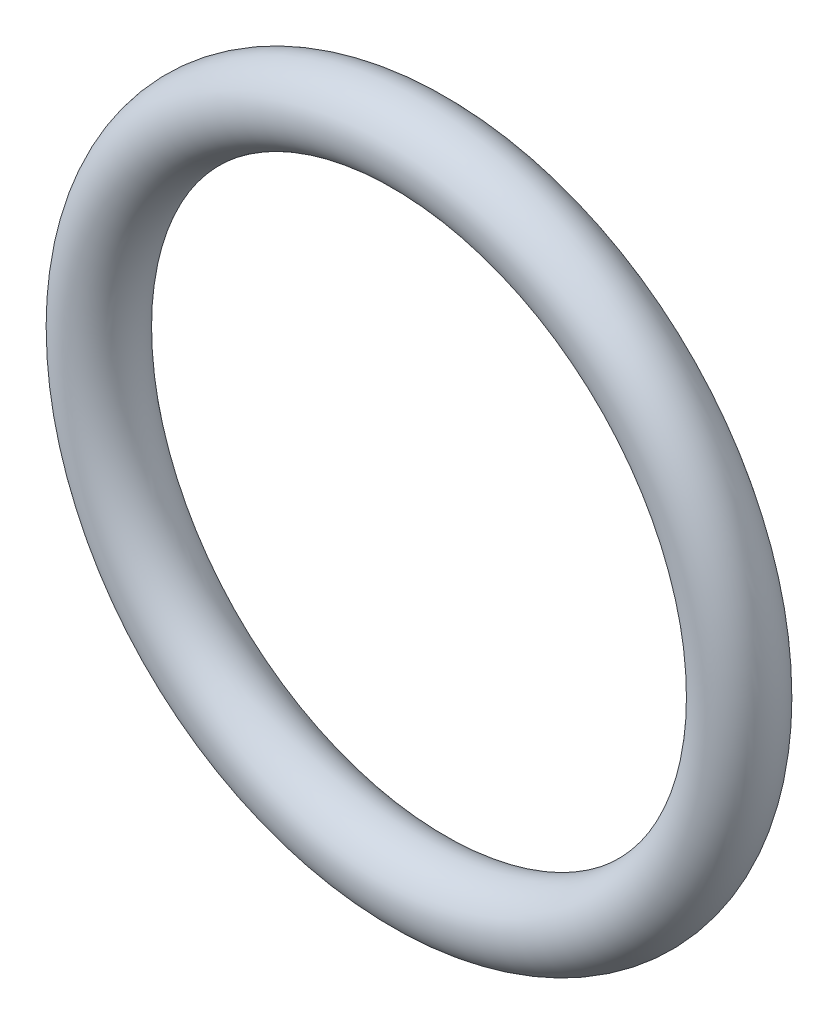
ISO-10303-21;
HEADER;
FILE_DESCRIPTION(('STEP AP214'),'2;1');
FILE_NAME('part.step','',(''),(''),'','','');
FILE_SCHEMA(('AUTOMOTIVE_DESIGN { 1 0 10303 214 1 1 1 1 }'));
ENDSEC;
DATA;
#1=APPLICATION_CONTEXT('core data for automotive mechanical design processes');
#2=APPLICATION_PROTOCOL_DEFINITION('international standard','automotive_design',2000,#1);
#3=PRODUCT_CONTEXT('',#1,'mechanical');
#4=PRODUCT('Part','Part','',(#3));
#5=PRODUCT_RELATED_PRODUCT_CATEGORY('part','',(#4));
#6=PRODUCT_DEFINITION_FORMATION('','',#4);
#7=PRODUCT_DEFINITION_CONTEXT('part definition',#1,'design');
#8=PRODUCT_DEFINITION('design','',#6,#7);
#9=PRODUCT_DEFINITION_SHAPE('','',#8);
#10=(LENGTH_UNIT() NAMED_UNIT(*) SI_UNIT(.MILLI.,.METRE.));
#11=(NAMED_UNIT(*) PLANE_ANGLE_UNIT() SI_UNIT($,.RADIAN.));
#12=(NAMED_UNIT(*) SI_UNIT($,.STERADIAN.) SOLID_ANGLE_UNIT());
#13=UNCERTAINTY_MEASURE_WITH_UNIT(LENGTH_MEASURE(1.E-05),#10,'distance_accuracy_value','');
#14=(GEOMETRIC_REPRESENTATION_CONTEXT(3) GLOBAL_UNCERTAINTY_ASSIGNED_CONTEXT((#13)) GLOBAL_UNIT_ASSIGNED_CONTEXT((#10,
#11,#12)) REPRESENTATION_CONTEXT('',''));
#15=CARTESIAN_POINT('',(0.,0.,0.));
#16=DIRECTION('',(0.,0.,1.));
#17=DIRECTION('',(1.,0.,0.));
#18=AXIS2_PLACEMENT_3D('',#15,#16,#17);
#19=CARTESIAN_POINT('',(0.,0.,-10.025));
#20=DIRECTION('',(0.,0.,-1.));
#21=DIRECTION('',(-1.,0.,0.));
#22=AXIS2_PLACEMENT_3D('',#19,#20,#21);
#23=TOROIDAL_SURFACE('',#22,9.484995,1.105);
#24=CARTESIAN_POINT('',(-10.589995,0.,-10.025));
#25=VERTEX_POINT('',#24);
#26=VERTEX_LOOP('',#25);
#27=FACE_BOUND('',#26,.T.);
#28=ADVANCED_FACE('F12',(#27),#23,.T.);
#29=CLOSED_SHELL('',(#28));
#30=MANIFOLD_SOLID_BREP('B1',#29);
#31=ADVANCED_BREP_SHAPE_REPRESENTATION('',(#18,#30),#14);
#32=SHAPE_DEFINITION_REPRESENTATION(#9,#31);
ENDSEC;
END-ISO-10303-21;
